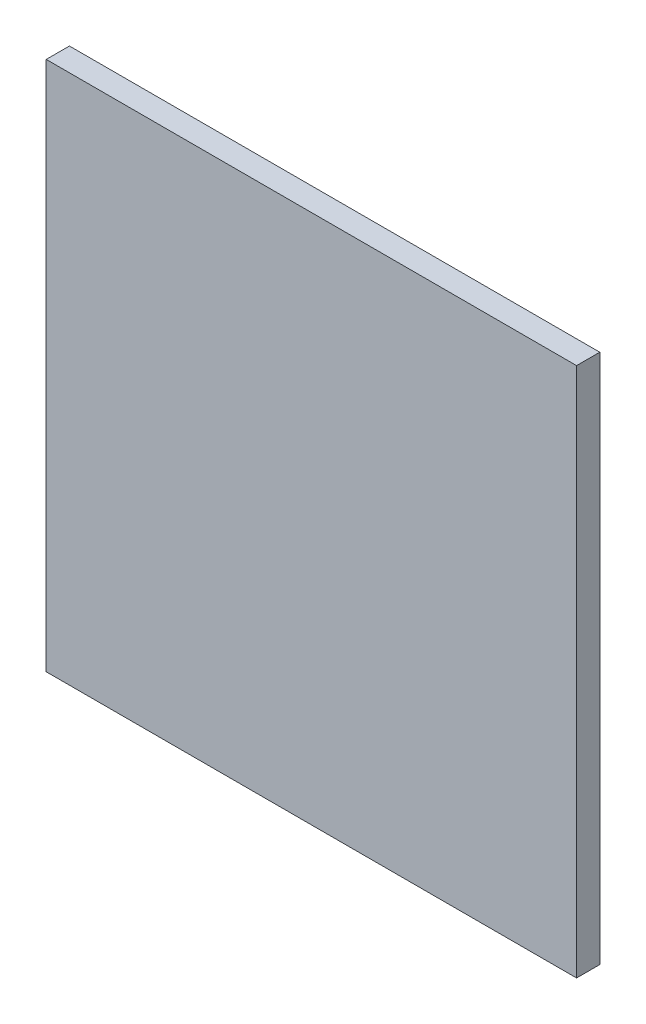
ISO-10303-21;
HEADER;
FILE_DESCRIPTION(('STEP AP214'),'2;1');
FILE_NAME('part.step','',(''),(''),'','','');
FILE_SCHEMA(('AUTOMOTIVE_DESIGN { 1 0 10303 214 1 1 1 1 }'));
ENDSEC;
DATA;
#1=APPLICATION_CONTEXT('core data for automotive mechanical design processes');
#2=APPLICATION_PROTOCOL_DEFINITION('international standard','automotive_design',2000,#1);
#3=PRODUCT_CONTEXT('',#1,'mechanical');
#4=PRODUCT('Part','Part','',(#3));
#5=PRODUCT_RELATED_PRODUCT_CATEGORY('part','',(#4));
#6=PRODUCT_DEFINITION_FORMATION('','',#4);
#7=PRODUCT_DEFINITION_CONTEXT('part definition',#1,'design');
#8=PRODUCT_DEFINITION('design','',#6,#7);
#9=PRODUCT_DEFINITION_SHAPE('','',#8);
#10=(LENGTH_UNIT() NAMED_UNIT(*) SI_UNIT(.MILLI.,.METRE.));
#11=(NAMED_UNIT(*) PLANE_ANGLE_UNIT() SI_UNIT($,.RADIAN.));
#12=(NAMED_UNIT(*) SI_UNIT($,.STERADIAN.) SOLID_ANGLE_UNIT());
#13=UNCERTAINTY_MEASURE_WITH_UNIT(LENGTH_MEASURE(1.E-05),#10,'distance_accuracy_value','');
#14=(GEOMETRIC_REPRESENTATION_CONTEXT(3) GLOBAL_UNCERTAINTY_ASSIGNED_CONTEXT((#13)) GLOBAL_UNIT_ASSIGNED_CONTEXT((#10,
#11,#12)) REPRESENTATION_CONTEXT('',''));
#15=CARTESIAN_POINT('',(0.,0.,0.));
#16=DIRECTION('',(0.,0.,1.));
#17=DIRECTION('',(1.,0.,0.));
#18=AXIS2_PLACEMENT_3D('',#15,#16,#17);
#19=CARTESIAN_POINT('',(-80.,80.,7.));
#20=DIRECTION('',(1.,0.,0.));
#21=DIRECTION('',(0.,1.,0.));
#22=AXIS2_PLACEMENT_3D('',#19,#20,#21);
#23=PLANE('',#22);
#24=DIRECTION('',(0.,-1.,0.));
#25=VECTOR('',#24,1.);
#26=CARTESIAN_POINT('',(-80.,80.,0.));
#27=LINE('',#26,#25);
#28=CARTESIAN_POINT('',(-80.,80.,0.));
#29=VERTEX_POINT('',#28);
#30=CARTESIAN_POINT('',(-80.,-80.,0.));
#31=VERTEX_POINT('',#30);
#32=EDGE_CURVE('E279',#29,#31,#27,.T.);
#33=ORIENTED_EDGE('',*,*,#32,.T.);
#34=DIRECTION('',(0.,0.,-1.));
#35=VECTOR('',#34,1.);
#36=CARTESIAN_POINT('',(-80.,-80.,7.));
#37=LINE('',#36,#35);
#38=CARTESIAN_POINT('',(-80.,-80.,7.));
#39=VERTEX_POINT('',#38);
#40=EDGE_CURVE('E11',#39,#31,#37,.T.);
#41=ORIENTED_EDGE('',*,*,#40,.F.);
#42=DIRECTION('',(0.,-1.,0.));
#43=VECTOR('',#42,1.);
#44=CARTESIAN_POINT('',(-80.,80.,7.));
#45=LINE('',#44,#43);
#46=CARTESIAN_POINT('',(-80.,80.,7.));
#47=VERTEX_POINT('',#46);
#48=EDGE_CURVE('E280',#47,#39,#45,.T.);
#49=ORIENTED_EDGE('',*,*,#48,.F.);
#50=DIRECTION('',(0.,0.,-1.));
#51=VECTOR('',#50,1.);
#52=CARTESIAN_POINT('',(-80.,80.,7.));
#53=LINE('',#52,#51);
#54=EDGE_CURVE('E49',#47,#29,#53,.T.);
#55=ORIENTED_EDGE('',*,*,#54,.T.);
#56=EDGE_LOOP('',(#33,#41,#49,#55));
#57=FACE_BOUND('',#56,.T.);
#58=ADVANCED_FACE('F33',(#57),#23,.F.);
#59=CARTESIAN_POINT('',(-80.,-80.,7.));
#60=DIRECTION('',(0.,1.,0.));
#61=DIRECTION('',(-1.,0.,0.));
#62=AXIS2_PLACEMENT_3D('',#59,#60,#61);
#63=PLANE('',#62);
#64=DIRECTION('',(1.,0.,0.));
#65=VECTOR('',#64,1.);
#66=CARTESIAN_POINT('',(-80.,-80.,0.));
#67=LINE('',#66,#65);
#68=CARTESIAN_POINT('',(80.,-80.,0.));
#69=VERTEX_POINT('',#68);
#70=EDGE_CURVE('E290',#31,#69,#67,.T.);
#71=ORIENTED_EDGE('',*,*,#70,.T.);
#72=DIRECTION('',(0.,0.,-1.));
#73=VECTOR('',#72,1.);
#74=CARTESIAN_POINT('',(80.,-80.,7.));
#75=LINE('',#74,#73);
#76=CARTESIAN_POINT('',(80.,-80.,7.));
#77=VERTEX_POINT('',#76);
#78=EDGE_CURVE('E41',#77,#69,#75,.T.);
#79=ORIENTED_EDGE('',*,*,#78,.F.);
#80=DIRECTION('',(1.,0.,0.));
#81=VECTOR('',#80,1.);
#82=CARTESIAN_POINT('',(-80.,-80.,7.));
#83=LINE('',#82,#81);
#84=EDGE_CURVE('E75',#39,#77,#83,.T.);
#85=ORIENTED_EDGE('',*,*,#84,.F.);
#86=ORIENTED_EDGE('',*,*,#40,.T.);
#87=EDGE_LOOP('',(#71,#79,#85,#86));
#88=FACE_BOUND('',#87,.T.);
#89=ADVANCED_FACE('F302',(#88),#63,.F.);
#90=CARTESIAN_POINT('',(80.,80.,7.));
#91=DIRECTION('',(1.,0.,0.));
#92=DIRECTION('',(0.,1.,0.));
#93=AXIS2_PLACEMENT_3D('',#90,#91,#92);
#94=PLANE('',#93);
#95=DIRECTION('',(0.,-1.,0.));
#96=VECTOR('',#95,1.);
#97=CARTESIAN_POINT('',(80.,80.,0.));
#98=LINE('',#97,#96);
#99=CARTESIAN_POINT('',(80.,80.,0.));
#100=VERTEX_POINT('',#99);
#101=EDGE_CURVE('E293',#100,#69,#98,.T.);
#102=ORIENTED_EDGE('',*,*,#101,.F.);
#103=DIRECTION('',(0.,0.,-1.));
#104=VECTOR('',#103,1.);
#105=CARTESIAN_POINT('',(80.,80.,7.));
#106=LINE('',#105,#104);
#107=CARTESIAN_POINT('',(80.,80.,7.));
#108=VERTEX_POINT('',#107);
#109=EDGE_CURVE('E64',#108,#100,#106,.T.);
#110=ORIENTED_EDGE('',*,*,#109,.F.);
#111=DIRECTION('',(0.,-1.,0.));
#112=VECTOR('',#111,1.);
#113=CARTESIAN_POINT('',(80.,80.,7.));
#114=LINE('',#113,#112);
#115=EDGE_CURVE('E284',#108,#77,#114,.T.);
#116=ORIENTED_EDGE('',*,*,#115,.T.);
#117=ORIENTED_EDGE('',*,*,#78,.T.);
#118=EDGE_LOOP('',(#102,#110,#116,#117));
#119=FACE_BOUND('',#118,.T.);
#120=ADVANCED_FACE('F300',(#119),#94,.T.);
#121=CARTESIAN_POINT('',(-80.,80.,7.));
#122=DIRECTION('',(0.,1.,0.));
#123=DIRECTION('',(-1.,0.,0.));
#124=AXIS2_PLACEMENT_3D('',#121,#122,#123);
#125=PLANE('',#124);
#126=DIRECTION('',(1.,0.,0.));
#127=VECTOR('',#126,1.);
#128=CARTESIAN_POINT('',(-80.,80.,0.));
#129=LINE('',#128,#127);
#130=EDGE_CURVE('E282',#29,#100,#129,.T.);
#131=ORIENTED_EDGE('',*,*,#130,.F.);
#132=ORIENTED_EDGE('',*,*,#54,.F.);
#133=DIRECTION('',(1.,0.,0.));
#134=VECTOR('',#133,1.);
#135=CARTESIAN_POINT('',(-80.,80.,7.));
#136=LINE('',#135,#134);
#137=EDGE_CURVE('E287',#47,#108,#136,.T.);
#138=ORIENTED_EDGE('',*,*,#137,.T.);
#139=ORIENTED_EDGE('',*,*,#109,.T.);
#140=EDGE_LOOP('',(#131,#132,#138,#139));
#141=FACE_BOUND('',#140,.T.);
#142=ADVANCED_FACE('F306',(#141),#125,.T.);
#143=CARTESIAN_POINT('',(0.,0.,7.));
#144=DIRECTION('',(0.,0.,1.));
#145=DIRECTION('',(1.,0.,0.));
#146=AXIS2_PLACEMENT_3D('',#143,#144,#145);
#147=PLANE('',#146);
#148=ORIENTED_EDGE('',*,*,#48,.T.);
#149=ORIENTED_EDGE('',*,*,#84,.T.);
#150=ORIENTED_EDGE('',*,*,#115,.F.);
#151=ORIENTED_EDGE('',*,*,#137,.F.);
#152=EDGE_LOOP('',(#148,#149,#150,#151));
#153=FACE_BOUND('',#152,.T.);
#154=ADVANCED_FACE('F308',(#153),#147,.T.);
#155=CARTESIAN_POINT('',(0.,0.,0.));
#156=DIRECTION('',(0.,0.,1.));
#157=DIRECTION('',(1.,0.,0.));
#158=AXIS2_PLACEMENT_3D('',#155,#156,#157);
#159=PLANE('',#158);
#160=CARTESIAN_POINT('',(0.,0.,0.));
#161=DIRECTION('',(0.,0.,1.));
#162=DIRECTION('',(1.,0.,0.));
#163=AXIS2_PLACEMENT_3D('',#160,#161,#162);
#164=CIRCLE('',#163,76.);
#165=CARTESIAN_POINT('',(76.,0.,0.));
#166=VERTEX_POINT('',#165);
#167=EDGE_CURVE('E221',#166,#166,#164,.T.);
#168=ORIENTED_EDGE('',*,*,#167,.T.);
#169=EDGE_LOOP('',(#168));
#170=FACE_BOUND('',#169,.T.);
#171=ORIENTED_EDGE('',*,*,#32,.F.);
#172=ORIENTED_EDGE('',*,*,#130,.T.);
#173=ORIENTED_EDGE('',*,*,#101,.T.);
#174=ORIENTED_EDGE('',*,*,#70,.F.);
#175=EDGE_LOOP('',(#171,#172,#173,#174));
#176=FACE_BOUND('',#175,.T.);
#177=ADVANCED_FACE('F305',(#170,#176),#159,.F.);
#178=CARTESIAN_POINT('',(0.,27.,3.));
#179=DIRECTION('',(0.,1.,0.));
#180=DIRECTION('',(0.,0.,1.));
#181=AXIS2_PLACEMENT_3D('',#178,#179,#180);
#182=PLANE('',#181);
#183=DIRECTION('',(1.,0.,0.));
#184=VECTOR('',#183,1.);
#185=CARTESIAN_POINT('',(0.,27.,1.));
#186=LINE('',#185,#184);
#187=CARTESIAN_POINT('',(-27.,27.,1.));
#188=VERTEX_POINT('',#187);
#189=CARTESIAN_POINT('',(-11.,27.,1.));
#190=VERTEX_POINT('',#189);
#191=EDGE_CURVE('E228',#188,#190,#186,.T.);
#192=ORIENTED_EDGE('',*,*,#191,.F.);
#193=DIRECTION('',(0.,0.,-1.));
#194=VECTOR('',#193,1.);
#195=CARTESIAN_POINT('',(-27.,27.,3.));
#196=LINE('',#195,#194);
#197=CARTESIAN_POINT('',(-27.,27.,3.));
#198=VERTEX_POINT('',#197);
#199=EDGE_CURVE('E220',#198,#188,#196,.T.);
#200=ORIENTED_EDGE('',*,*,#199,.F.);
#201=DIRECTION('',(1.,0.,0.));
#202=VECTOR('',#201,1.);
#203=CARTESIAN_POINT('',(0.,27.,3.));
#204=LINE('',#203,#202);
#205=CARTESIAN_POINT('',(-11.,27.,3.));
#206=VERTEX_POINT('',#205);
#207=EDGE_CURVE('E204',#198,#206,#204,.T.);
#208=ORIENTED_EDGE('',*,*,#207,.T.);
#209=DIRECTION('',(0.,0.,-1.));
#210=VECTOR('',#209,1.);
#211=CARTESIAN_POINT('',(-11.,27.,3.));
#212=LINE('',#211,#210);
#213=EDGE_CURVE('E218',#206,#190,#212,.T.);
#214=ORIENTED_EDGE('',*,*,#213,.T.);
#215=EDGE_LOOP('',(#192,#200,#208,#214));
#216=FACE_BOUND('',#215,.T.);
#217=ADVANCED_FACE('F217',(#216),#182,.T.);
#218=CARTESIAN_POINT('',(-11.,0.,3.));
#219=DIRECTION('',(-1.,0.,0.));
#220=DIRECTION('',(0.,-1.,0.));
#221=AXIS2_PLACEMENT_3D('',#218,#219,#220);
#222=PLANE('',#221);
#223=DIRECTION('',(0.,1.,0.));
#224=VECTOR('',#223,1.);
#225=CARTESIAN_POINT('',(-11.,0.,1.));
#226=LINE('',#225,#224);
#227=CARTESIAN_POINT('',(-11.,51.,1.));
#228=VERTEX_POINT('',#227);
#229=EDGE_CURVE('E225',#190,#228,#226,.T.);
#230=ORIENTED_EDGE('',*,*,#229,.F.);
#231=ORIENTED_EDGE('',*,*,#213,.F.);
#232=DIRECTION('',(0.,1.,0.));
#233=VECTOR('',#232,1.);
#234=CARTESIAN_POINT('',(-11.,0.,3.));
#235=LINE('',#234,#233);
#236=CARTESIAN_POINT('',(-11.,51.,3.));
#237=VERTEX_POINT('',#236);
#238=EDGE_CURVE('E199',#206,#237,#235,.T.);
#239=ORIENTED_EDGE('',*,*,#238,.T.);
#240=DIRECTION('',(0.,0.,-1.));
#241=VECTOR('',#240,1.);
#242=CARTESIAN_POINT('',(-11.,51.,3.));
#243=LINE('',#242,#241);
#244=EDGE_CURVE('E226',#237,#228,#243,.T.);
#245=ORIENTED_EDGE('',*,*,#244,.T.);
#246=EDGE_LOOP('',(#230,#231,#239,#245));
#247=FACE_BOUND('',#246,.T.);
#248=ADVANCED_FACE('F223',(#247),#222,.T.);
#249=CARTESIAN_POINT('',(0.,51.,3.));
#250=DIRECTION('',(0.,-1.,0.));
#251=DIRECTION('',(1.,0.,0.));
#252=AXIS2_PLACEMENT_3D('',#249,#250,#251);
#253=PLANE('',#252);
#254=ORIENTED_EDGE('',*,*,#244,.F.);
#255=DIRECTION('',(-1.,0.,0.));
#256=VECTOR('',#255,1.);
#257=CARTESIAN_POINT('',(0.,51.,3.));
#258=LINE('',#257,#256);
#259=CARTESIAN_POINT('',(11.,51.,3.));
#260=VERTEX_POINT('',#259);
#261=EDGE_CURVE('E207',#260,#237,#258,.T.);
#262=ORIENTED_EDGE('',*,*,#261,.F.);
#263=DIRECTION('',(0.,0.,-1.));
#264=VECTOR('',#263,1.);
#265=CARTESIAN_POINT('',(11.,51.,3.));
#266=LINE('',#265,#264);
#267=CARTESIAN_POINT('',(11.,51.,1.));
#268=VERTEX_POINT('',#267);
#269=EDGE_CURVE('E230',#260,#268,#266,.T.);
#270=ORIENTED_EDGE('',*,*,#269,.T.);
#271=DIRECTION('',(-1.,0.,0.));
#272=VECTOR('',#271,1.);
#273=CARTESIAN_POINT('',(0.,51.,1.));
#274=LINE('',#273,#272);
#275=EDGE_CURVE('E277',#268,#228,#274,.T.);
#276=ORIENTED_EDGE('',*,*,#275,.T.);
#277=EDGE_LOOP('',(#254,#262,#270,#276));
#278=FACE_BOUND('',#277,.T.);
#279=ADVANCED_FACE('F365',(#278),#253,.F.);
#280=CARTESIAN_POINT('',(11.,0.,3.));
#281=DIRECTION('',(-1.,0.,0.));
#282=DIRECTION('',(0.,-1.,0.));
#283=AXIS2_PLACEMENT_3D('',#280,#281,#282);
#284=PLANE('',#283);
#285=ORIENTED_EDGE('',*,*,#269,.F.);
#286=DIRECTION('',(0.,1.,0.));
#287=VECTOR('',#286,1.);
#288=CARTESIAN_POINT('',(11.,0.,3.));
#289=LINE('',#288,#287);
#290=CARTESIAN_POINT('',(11.,27.,3.));
#291=VERTEX_POINT('',#290);
#292=EDGE_CURVE('E634',#291,#260,#289,.T.);
#293=ORIENTED_EDGE('',*,*,#292,.F.);
#294=DIRECTION('',(0.,0.,-1.));
#295=VECTOR('',#294,1.);
#296=CARTESIAN_POINT('',(11.,27.,3.));
#297=LINE('',#296,#295);
#298=CARTESIAN_POINT('',(11.,27.,1.));
#299=VERTEX_POINT('',#298);
#300=EDGE_CURVE('E630',#291,#299,#297,.T.);
#301=ORIENTED_EDGE('',*,*,#300,.T.);
#302=DIRECTION('',(0.,1.,0.));
#303=VECTOR('',#302,1.);
#304=CARTESIAN_POINT('',(11.,0.,1.));
#305=LINE('',#304,#303);
#306=EDGE_CURVE('E275',#299,#268,#305,.T.);
#307=ORIENTED_EDGE('',*,*,#306,.T.);
#308=EDGE_LOOP('',(#285,#293,#301,#307));
#309=FACE_BOUND('',#308,.T.);
#310=ADVANCED_FACE('F374',(#309),#284,.F.);
#311=CARTESIAN_POINT('',(0.,27.,3.));
#312=DIRECTION('',(0.,-1.,0.));
#313=DIRECTION('',(0.,0.,-1.));
#314=AXIS2_PLACEMENT_3D('',#311,#312,#313);
#315=PLANE('',#314);
#316=ORIENTED_EDGE('',*,*,#300,.F.);
#317=DIRECTION('',(-1.,0.,0.));
#318=VECTOR('',#317,1.);
#319=CARTESIAN_POINT('',(0.,27.,3.));
#320=LINE('',#319,#318);
#321=CARTESIAN_POINT('',(27.,27.,3.));
#322=VERTEX_POINT('',#321);
#323=EDGE_CURVE('E640',#322,#291,#320,.T.);
#324=ORIENTED_EDGE('',*,*,#323,.F.);
#325=DIRECTION('',(0.,0.,-1.));
#326=VECTOR('',#325,1.);
#327=CARTESIAN_POINT('',(27.,27.,3.));
#328=LINE('',#327,#326);
#329=CARTESIAN_POINT('',(27.,27.,1.));
#330=VERTEX_POINT('',#329);
#331=EDGE_CURVE('E627',#322,#330,#328,.T.);
#332=ORIENTED_EDGE('',*,*,#331,.T.);
#333=DIRECTION('',(-1.,0.,0.));
#334=VECTOR('',#333,1.);
#335=CARTESIAN_POINT('',(0.,27.,1.));
#336=LINE('',#335,#334);
#337=EDGE_CURVE('E273',#330,#299,#336,.T.);
#338=ORIENTED_EDGE('',*,*,#337,.T.);
#339=EDGE_LOOP('',(#316,#324,#332,#338));
#340=FACE_BOUND('',#339,.T.);
#341=ADVANCED_FACE('F384',(#340),#315,.F.);
#342=CARTESIAN_POINT('',(27.,0.,3.));
#343=DIRECTION('',(-1.,0.,0.));
#344=DIRECTION('',(0.,-1.,0.));
#345=AXIS2_PLACEMENT_3D('',#342,#343,#344);
#346=PLANE('',#345);
#347=ORIENTED_EDGE('',*,*,#331,.F.);
#348=DIRECTION('',(0.,1.,0.));
#349=VECTOR('',#348,1.);
#350=CARTESIAN_POINT('',(27.,0.,3.));
#351=LINE('',#350,#349);
#352=CARTESIAN_POINT('',(27.,11.,3.));
#353=VERTEX_POINT('',#352);
#354=EDGE_CURVE('E643',#353,#322,#351,.T.);
#355=ORIENTED_EDGE('',*,*,#354,.F.);
#356=DIRECTION('',(0.,0.,-1.));
#357=VECTOR('',#356,1.);
#358=CARTESIAN_POINT('',(27.,11.,3.));
#359=LINE('',#358,#357);
#360=CARTESIAN_POINT('',(27.,11.,1.));
#361=VERTEX_POINT('',#360);
#362=EDGE_CURVE('E624',#353,#361,#359,.T.);
#363=ORIENTED_EDGE('',*,*,#362,.T.);
#364=DIRECTION('',(0.,1.,0.));
#365=VECTOR('',#364,1.);
#366=CARTESIAN_POINT('',(27.,0.,1.));
#367=LINE('',#366,#365);
#368=EDGE_CURVE('E271',#361,#330,#367,.T.);
#369=ORIENTED_EDGE('',*,*,#368,.T.);
#370=EDGE_LOOP('',(#347,#355,#363,#369));
#371=FACE_BOUND('',#370,.T.);
#372=ADVANCED_FACE('F394',(#371),#346,.F.);
#373=CARTESIAN_POINT('',(0.,11.,3.));
#374=DIRECTION('',(0.,-1.,0.));
#375=DIRECTION('',(1.,0.,0.));
#376=AXIS2_PLACEMENT_3D('',#373,#374,#375);
#377=PLANE('',#376);
#378=ORIENTED_EDGE('',*,*,#362,.F.);
#379=DIRECTION('',(-1.,0.,0.));
#380=VECTOR('',#379,1.);
#381=CARTESIAN_POINT('',(0.,11.,3.));
#382=LINE('',#381,#380);
#383=CARTESIAN_POINT('',(51.,11.,3.));
#384=VERTEX_POINT('',#383);
#385=EDGE_CURVE('E646',#384,#353,#382,.T.);
#386=ORIENTED_EDGE('',*,*,#385,.F.);
#387=DIRECTION('',(0.,0.,-1.));
#388=VECTOR('',#387,1.);
#389=CARTESIAN_POINT('',(51.,11.,3.));
#390=LINE('',#389,#388);
#391=CARTESIAN_POINT('',(51.,11.,1.));
#392=VERTEX_POINT('',#391);
#393=EDGE_CURVE('E621',#384,#392,#390,.T.);
#394=ORIENTED_EDGE('',*,*,#393,.T.);
#395=DIRECTION('',(-1.,0.,0.));
#396=VECTOR('',#395,1.);
#397=CARTESIAN_POINT('',(0.,11.,1.));
#398=LINE('',#397,#396);
#399=EDGE_CURVE('E269',#392,#361,#398,.T.);
#400=ORIENTED_EDGE('',*,*,#399,.T.);
#401=EDGE_LOOP('',(#378,#386,#394,#400));
#402=FACE_BOUND('',#401,.T.);
#403=ADVANCED_FACE('F404',(#402),#377,.F.);
#404=CARTESIAN_POINT('',(51.,0.,3.));
#405=DIRECTION('',(1.,0.,0.));
#406=DIRECTION('',(0.,0.,-1.));
#407=AXIS2_PLACEMENT_3D('',#404,#405,#406);
#408=PLANE('',#407);
#409=DIRECTION('',(0.,-1.,0.));
#410=VECTOR('',#409,1.);
#411=CARTESIAN_POINT('',(51.,0.,1.));
#412=LINE('',#411,#410);
#413=CARTESIAN_POINT('',(51.,-11.,1.));
#414=VERTEX_POINT('',#413);
#415=EDGE_CURVE('E266',#392,#414,#412,.T.);
#416=ORIENTED_EDGE('',*,*,#415,.F.);
#417=ORIENTED_EDGE('',*,*,#393,.F.);
#418=DIRECTION('',(0.,-1.,0.));
#419=VECTOR('',#418,1.);
#420=CARTESIAN_POINT('',(51.,0.,3.));
#421=LINE('',#420,#419);
#422=CARTESIAN_POINT('',(51.,-11.,3.));
#423=VERTEX_POINT('',#422);
#424=EDGE_CURVE('E649',#384,#423,#421,.T.);
#425=ORIENTED_EDGE('',*,*,#424,.T.);
#426=DIRECTION('',(0.,0.,-1.));
#427=VECTOR('',#426,1.);
#428=CARTESIAN_POINT('',(51.,-11.,3.));
#429=LINE('',#428,#427);
#430=EDGE_CURVE('E618',#423,#414,#429,.T.);
#431=ORIENTED_EDGE('',*,*,#430,.T.);
#432=EDGE_LOOP('',(#416,#417,#425,#431));
#433=FACE_BOUND('',#432,.T.);
#434=ADVANCED_FACE('F414',(#433),#408,.T.);
#435=CARTESIAN_POINT('',(0.,-11.,3.));
#436=DIRECTION('',(0.,-1.,0.));
#437=DIRECTION('',(1.,0.,0.));
#438=AXIS2_PLACEMENT_3D('',#435,#436,#437);
#439=PLANE('',#438);
#440=DIRECTION('',(-1.,0.,0.));
#441=VECTOR('',#440,1.);
#442=CARTESIAN_POINT('',(0.,-11.,1.));
#443=LINE('',#442,#441);
#444=CARTESIAN_POINT('',(27.,-11.,1.));
#445=VERTEX_POINT('',#444);
#446=EDGE_CURVE('E263',#414,#445,#443,.T.);
#447=ORIENTED_EDGE('',*,*,#446,.F.);
#448=ORIENTED_EDGE('',*,*,#430,.F.);
#449=DIRECTION('',(-1.,0.,0.));
#450=VECTOR('',#449,1.);
#451=CARTESIAN_POINT('',(0.,-11.,3.));
#452=LINE('',#451,#450);
#453=CARTESIAN_POINT('',(27.,-11.,3.));
#454=VERTEX_POINT('',#453);
#455=EDGE_CURVE('E651',#423,#454,#452,.T.);
#456=ORIENTED_EDGE('',*,*,#455,.T.);
#457=DIRECTION('',(0.,0.,-1.));
#458=VECTOR('',#457,1.);
#459=CARTESIAN_POINT('',(27.,-11.,3.));
#460=LINE('',#459,#458);
#461=EDGE_CURVE('E615',#454,#445,#460,.T.);
#462=ORIENTED_EDGE('',*,*,#461,.T.);
#463=EDGE_LOOP('',(#447,#448,#456,#462));
#464=FACE_BOUND('',#463,.T.);
#465=ADVANCED_FACE('F424',(#464),#439,.T.);
#466=CARTESIAN_POINT('',(27.,0.,3.));
#467=DIRECTION('',(1.,0.,0.));
#468=DIRECTION('',(0.,1.,0.));
#469=AXIS2_PLACEMENT_3D('',#466,#467,#468);
#470=PLANE('',#469);
#471=DIRECTION('',(0.,-1.,0.));
#472=VECTOR('',#471,1.);
#473=CARTESIAN_POINT('',(27.,0.,1.));
#474=LINE('',#473,#472);
#475=CARTESIAN_POINT('',(27.,-27.,1.));
#476=VERTEX_POINT('',#475);
#477=EDGE_CURVE('E260',#445,#476,#474,.T.);
#478=ORIENTED_EDGE('',*,*,#477,.F.);
#479=ORIENTED_EDGE('',*,*,#461,.F.);
#480=DIRECTION('',(0.,-1.,0.));
#481=VECTOR('',#480,1.);
#482=CARTESIAN_POINT('',(27.,0.,3.));
#483=LINE('',#482,#481);
#484=CARTESIAN_POINT('',(27.,-27.,3.));
#485=VERTEX_POINT('',#484);
#486=EDGE_CURVE('E655',#454,#485,#483,.T.);
#487=ORIENTED_EDGE('',*,*,#486,.T.);
#488=DIRECTION('',(0.,0.,-1.));
#489=VECTOR('',#488,1.);
#490=CARTESIAN_POINT('',(27.,-27.,3.));
#491=LINE('',#490,#489);
#492=EDGE_CURVE('E612',#485,#476,#491,.T.);
#493=ORIENTED_EDGE('',*,*,#492,.T.);
#494=EDGE_LOOP('',(#478,#479,#487,#493));
#495=FACE_BOUND('',#494,.T.);
#496=ADVANCED_FACE('F434',(#495),#470,.T.);
#497=CARTESIAN_POINT('',(0.,-27.,3.));
#498=DIRECTION('',(0.,-1.,0.));
#499=DIRECTION('',(0.,0.,-1.));
#500=AXIS2_PLACEMENT_3D('',#497,#498,#499);
#501=PLANE('',#500);
#502=DIRECTION('',(-1.,0.,0.));
#503=VECTOR('',#502,1.);
#504=CARTESIAN_POINT('',(0.,-27.,1.));
#505=LINE('',#504,#503);
#506=CARTESIAN_POINT('',(11.,-27.,1.));
#507=VERTEX_POINT('',#506);
#508=EDGE_CURVE('E257',#476,#507,#505,.T.);
#509=ORIENTED_EDGE('',*,*,#508,.F.);
#510=ORIENTED_EDGE('',*,*,#492,.F.);
#511=DIRECTION('',(-1.,0.,0.));
#512=VECTOR('',#511,1.);
#513=CARTESIAN_POINT('',(0.,-27.,3.));
#514=LINE('',#513,#512);
#515=CARTESIAN_POINT('',(11.,-27.,3.));
#516=VERTEX_POINT('',#515);
#517=EDGE_CURVE('E657',#485,#516,#514,.T.);
#518=ORIENTED_EDGE('',*,*,#517,.T.);
#519=DIRECTION('',(0.,0.,-1.));
#520=VECTOR('',#519,1.);
#521=CARTESIAN_POINT('',(11.,-27.,3.));
#522=LINE('',#521,#520);
#523=EDGE_CURVE('E609',#516,#507,#522,.T.);
#524=ORIENTED_EDGE('',*,*,#523,.T.);
#525=EDGE_LOOP('',(#509,#510,#518,#524));
#526=FACE_BOUND('',#525,.T.);
#527=ADVANCED_FACE('F444',(#526),#501,.T.);
#528=CARTESIAN_POINT('',(11.,0.,3.));
#529=DIRECTION('',(1.,0.,0.));
#530=DIRECTION('',(0.,1.,0.));
#531=AXIS2_PLACEMENT_3D('',#528,#529,#530);
#532=PLANE('',#531);
#533=DIRECTION('',(0.,-1.,0.));
#534=VECTOR('',#533,1.);
#535=CARTESIAN_POINT('',(11.,0.,1.));
#536=LINE('',#535,#534);
#537=CARTESIAN_POINT('',(11.,-51.,1.));
#538=VERTEX_POINT('',#537);
#539=EDGE_CURVE('E254',#507,#538,#536,.T.);
#540=ORIENTED_EDGE('',*,*,#539,.F.);
#541=ORIENTED_EDGE('',*,*,#523,.F.);
#542=DIRECTION('',(0.,-1.,0.));
#543=VECTOR('',#542,1.);
#544=CARTESIAN_POINT('',(11.,0.,3.));
#545=LINE('',#544,#543);
#546=CARTESIAN_POINT('',(11.,-51.,3.));
#547=VERTEX_POINT('',#546);
#548=EDGE_CURVE('E663',#516,#547,#545,.T.);
#549=ORIENTED_EDGE('',*,*,#548,.T.);
#550=DIRECTION('',(0.,0.,-1.));
#551=VECTOR('',#550,1.);
#552=CARTESIAN_POINT('',(11.,-51.,3.));
#553=LINE('',#552,#551);
#554=EDGE_CURVE('E606',#547,#538,#553,.T.);
#555=ORIENTED_EDGE('',*,*,#554,.T.);
#556=EDGE_LOOP('',(#540,#541,#549,#555));
#557=FACE_BOUND('',#556,.T.);
#558=ADVANCED_FACE('F454',(#557),#532,.T.);
#559=CARTESIAN_POINT('',(-2.57369882981286E-13,-50.9999999999999,3.));
#560=DIRECTION('',(0.,-1.,0.));
#561=DIRECTION('',(1.,0.,0.));
#562=AXIS2_PLACEMENT_3D('',#559,#560,#561);
#563=PLANE('',#562);
#564=DIRECTION('',(-1.,0.,0.));
#565=VECTOR('',#564,1.);
#566=CARTESIAN_POINT('',(-2.57369882981286E-13,-50.9999999999999,1.));
#567=LINE('',#566,#565);
#568=CARTESIAN_POINT('',(-11.,-50.9999999999999,1.));
#569=VERTEX_POINT('',#568);
#570=EDGE_CURVE('E251',#538,#569,#567,.T.);
#571=ORIENTED_EDGE('',*,*,#570,.F.);
#572=ORIENTED_EDGE('',*,*,#554,.F.);
#573=DIRECTION('',(-1.,0.,0.));
#574=VECTOR('',#573,1.);
#575=CARTESIAN_POINT('',(-2.57369882981286E-13,-50.9999999999999,3.));
#576=LINE('',#575,#574);
#577=CARTESIAN_POINT('',(-11.,-50.9999999999999,3.));
#578=VERTEX_POINT('',#577);
#579=EDGE_CURVE('E665',#547,#578,#576,.T.);
#580=ORIENTED_EDGE('',*,*,#579,.T.);
#581=DIRECTION('',(0.,0.,-1.));
#582=VECTOR('',#581,1.);
#583=CARTESIAN_POINT('',(-11.,-50.9999999999999,3.));
#584=LINE('',#583,#582);
#585=EDGE_CURVE('E603',#578,#569,#584,.T.);
#586=ORIENTED_EDGE('',*,*,#585,.T.);
#587=EDGE_LOOP('',(#571,#572,#580,#586));
#588=FACE_BOUND('',#587,.T.);
#589=ADVANCED_FACE('F464',(#588),#563,.T.);
#590=CARTESIAN_POINT('',(-11.,0.,3.));
#591=DIRECTION('',(1.,0.,0.));
#592=DIRECTION('',(0.,1.,0.));
#593=AXIS2_PLACEMENT_3D('',#590,#591,#592);
#594=PLANE('',#593);
#595=ORIENTED_EDGE('',*,*,#585,.F.);
#596=DIRECTION('',(0.,-1.,0.));
#597=VECTOR('',#596,1.);
#598=CARTESIAN_POINT('',(-11.,0.,3.));
#599=LINE('',#598,#597);
#600=CARTESIAN_POINT('',(-11.,-26.9999999999999,3.));
#601=VERTEX_POINT('',#600);
#602=EDGE_CURVE('E667',#601,#578,#599,.T.);
#603=ORIENTED_EDGE('',*,*,#602,.F.);
#604=DIRECTION('',(0.,0.,-1.));
#605=VECTOR('',#604,1.);
#606=CARTESIAN_POINT('',(-11.,-26.9999999999999,3.));
#607=LINE('',#606,#605);
#608=CARTESIAN_POINT('',(-11.,-26.9999999999999,1.));
#609=VERTEX_POINT('',#608);
#610=EDGE_CURVE('E600',#601,#609,#607,.T.);
#611=ORIENTED_EDGE('',*,*,#610,.T.);
#612=DIRECTION('',(0.,-1.,0.));
#613=VECTOR('',#612,1.);
#614=CARTESIAN_POINT('',(-11.,0.,1.));
#615=LINE('',#614,#613);
#616=EDGE_CURVE('E249',#609,#569,#615,.T.);
#617=ORIENTED_EDGE('',*,*,#616,.T.);
#618=EDGE_LOOP('',(#595,#603,#611,#617));
#619=FACE_BOUND('',#618,.T.);
#620=ADVANCED_FACE('F474',(#619),#594,.F.);
#621=CARTESIAN_POINT('',(0.,-26.9999999999999,3.));
#622=DIRECTION('',(0.,1.,0.));
#623=DIRECTION('',(0.,0.,1.));
#624=AXIS2_PLACEMENT_3D('',#621,#622,#623);
#625=PLANE('',#624);
#626=ORIENTED_EDGE('',*,*,#610,.F.);
#627=DIRECTION('',(1.,0.,0.));
#628=VECTOR('',#627,1.);
#629=CARTESIAN_POINT('',(0.,-26.9999999999999,3.));
#630=LINE('',#629,#628);
#631=CARTESIAN_POINT('',(-27.,-26.9999999999999,3.));
#632=VERTEX_POINT('',#631);
#633=EDGE_CURVE('E670',#632,#601,#630,.T.);
#634=ORIENTED_EDGE('',*,*,#633,.F.);
#635=DIRECTION('',(0.,0.,-1.));
#636=VECTOR('',#635,1.);
#637=CARTESIAN_POINT('',(-27.,-26.9999999999999,3.));
#638=LINE('',#637,#636);
#639=CARTESIAN_POINT('',(-27.,-26.9999999999999,1.));
#640=VERTEX_POINT('',#639);
#641=EDGE_CURVE('E597',#632,#640,#638,.T.);
#642=ORIENTED_EDGE('',*,*,#641,.T.);
#643=DIRECTION('',(1.,0.,0.));
#644=VECTOR('',#643,1.);
#645=CARTESIAN_POINT('',(0.,-26.9999999999999,1.));
#646=LINE('',#645,#644);
#647=EDGE_CURVE('E247',#640,#609,#646,.T.);
#648=ORIENTED_EDGE('',*,*,#647,.T.);
#649=EDGE_LOOP('',(#626,#634,#642,#648));
#650=FACE_BOUND('',#649,.T.);
#651=ADVANCED_FACE('F484',(#650),#625,.F.);
#652=CARTESIAN_POINT('',(-27.,0.,3.));
#653=DIRECTION('',(1.,0.,0.));
#654=DIRECTION('',(0.,1.,0.));
#655=AXIS2_PLACEMENT_3D('',#652,#653,#654);
#656=PLANE('',#655);
#657=ORIENTED_EDGE('',*,*,#641,.F.);
#658=DIRECTION('',(0.,-1.,0.));
#659=VECTOR('',#658,1.);
#660=CARTESIAN_POINT('',(-27.,0.,3.));
#661=LINE('',#660,#659);
#662=CARTESIAN_POINT('',(-27.,-10.9999999999999,3.));
#663=VERTEX_POINT('',#662);
#664=EDGE_CURVE('E673',#663,#632,#661,.T.);
#665=ORIENTED_EDGE('',*,*,#664,.F.);
#666=DIRECTION('',(0.,0.,-1.));
#667=VECTOR('',#666,1.);
#668=CARTESIAN_POINT('',(-27.,-10.9999999999999,3.));
#669=LINE('',#668,#667);
#670=CARTESIAN_POINT('',(-27.,-10.9999999999999,1.));
#671=VERTEX_POINT('',#670);
#672=EDGE_CURVE('E594',#663,#671,#669,.T.);
#673=ORIENTED_EDGE('',*,*,#672,.T.);
#674=DIRECTION('',(0.,-1.,0.));
#675=VECTOR('',#674,1.);
#676=CARTESIAN_POINT('',(-27.,0.,1.));
#677=LINE('',#676,#675);
#678=EDGE_CURVE('E245',#671,#640,#677,.T.);
#679=ORIENTED_EDGE('',*,*,#678,.T.);
#680=EDGE_LOOP('',(#657,#665,#673,#679));
#681=FACE_BOUND('',#680,.T.);
#682=ADVANCED_FACE('F494',(#681),#656,.F.);
#683=CARTESIAN_POINT('',(0.,-10.9999999999999,3.));
#684=DIRECTION('',(0.,1.,0.));
#685=DIRECTION('',(-1.,0.,0.));
#686=AXIS2_PLACEMENT_3D('',#683,#684,#685);
#687=PLANE('',#686);
#688=ORIENTED_EDGE('',*,*,#672,.F.);
#689=DIRECTION('',(1.,0.,0.));
#690=VECTOR('',#689,1.);
#691=CARTESIAN_POINT('',(0.,-10.9999999999999,3.));
#692=LINE('',#691,#690);
#693=CARTESIAN_POINT('',(-51.,-10.9999999999999,3.));
#694=VERTEX_POINT('',#693);
#695=EDGE_CURVE('E676',#694,#663,#692,.T.);
#696=ORIENTED_EDGE('',*,*,#695,.F.);
#697=DIRECTION('',(0.,0.,-1.));
#698=VECTOR('',#697,1.);
#699=CARTESIAN_POINT('',(-51.,-10.9999999999999,3.));
#700=LINE('',#699,#698);
#701=CARTESIAN_POINT('',(-51.,-10.9999999999999,1.));
#702=VERTEX_POINT('',#701);
#703=EDGE_CURVE('E586',#694,#702,#700,.T.);
#704=ORIENTED_EDGE('',*,*,#703,.T.);
#705=DIRECTION('',(1.,0.,0.));
#706=VECTOR('',#705,1.);
#707=CARTESIAN_POINT('',(0.,-10.9999999999999,1.));
#708=LINE('',#707,#706);
#709=EDGE_CURVE('E243',#702,#671,#708,.T.);
#710=ORIENTED_EDGE('',*,*,#709,.T.);
#711=EDGE_LOOP('',(#688,#696,#704,#710));
#712=FACE_BOUND('',#711,.T.);
#713=ADVANCED_FACE('F504',(#712),#687,.F.);
#714=CARTESIAN_POINT('',(-51.,0.,3.));
#715=DIRECTION('',(1.,0.,0.));
#716=DIRECTION('',(0.,0.,-1.));
#717=AXIS2_PLACEMENT_3D('',#714,#715,#716);
#718=PLANE('',#717);
#719=ORIENTED_EDGE('',*,*,#703,.F.);
#720=DIRECTION('',(0.,-1.,0.));
#721=VECTOR('',#720,1.);
#722=CARTESIAN_POINT('',(-51.,0.,3.));
#723=LINE('',#722,#721);
#724=CARTESIAN_POINT('',(-51.,11.,3.));
#725=VERTEX_POINT('',#724);
#726=EDGE_CURVE('E679',#725,#694,#723,.T.);
#727=ORIENTED_EDGE('',*,*,#726,.F.);
#728=DIRECTION('',(0.,0.,-1.));
#729=VECTOR('',#728,1.);
#730=CARTESIAN_POINT('',(-51.,11.,3.));
#731=LINE('',#730,#729);
#732=CARTESIAN_POINT('',(-51.,11.,1.));
#733=VERTEX_POINT('',#732);
#734=EDGE_CURVE('E584',#725,#733,#731,.T.);
#735=ORIENTED_EDGE('',*,*,#734,.T.);
#736=DIRECTION('',(0.,-1.,0.));
#737=VECTOR('',#736,1.);
#738=CARTESIAN_POINT('',(-51.,0.,1.));
#739=LINE('',#738,#737);
#740=EDGE_CURVE('E241',#733,#702,#739,.T.);
#741=ORIENTED_EDGE('',*,*,#740,.T.);
#742=EDGE_LOOP('',(#719,#727,#735,#741));
#743=FACE_BOUND('',#742,.T.);
#744=ADVANCED_FACE('F514',(#743),#718,.F.);
#745=CARTESIAN_POINT('',(0.,11.0000000000001,3.));
#746=DIRECTION('',(0.,1.,0.));
#747=DIRECTION('',(-1.,0.,0.));
#748=AXIS2_PLACEMENT_3D('',#745,#746,#747);
#749=PLANE('',#748);
#750=DIRECTION('',(1.,0.,0.));
#751=VECTOR('',#750,1.);
#752=CARTESIAN_POINT('',(0.,11.0000000000001,1.));
#753=LINE('',#752,#751);
#754=CARTESIAN_POINT('',(-27.,11.0000000000001,1.));
#755=VERTEX_POINT('',#754);
#756=EDGE_CURVE('E238',#733,#755,#753,.T.);
#757=ORIENTED_EDGE('',*,*,#756,.F.);
#758=ORIENTED_EDGE('',*,*,#734,.F.);
#759=DIRECTION('',(1.,0.,0.));
#760=VECTOR('',#759,1.);
#761=CARTESIAN_POINT('',(0.,11.0000000000001,3.));
#762=LINE('',#761,#760);
#763=CARTESIAN_POINT('',(-27.,11.0000000000001,3.));
#764=VERTEX_POINT('',#763);
#765=EDGE_CURVE('E583',#725,#764,#762,.T.);
#766=ORIENTED_EDGE('',*,*,#765,.T.);
#767=DIRECTION('',(0.,0.,-1.));
#768=VECTOR('',#767,1.);
#769=CARTESIAN_POINT('',(-27.,11.0000000000001,3.));
#770=LINE('',#769,#768);
#771=EDGE_CURVE('E580',#764,#755,#770,.T.);
#772=ORIENTED_EDGE('',*,*,#771,.T.);
#773=EDGE_LOOP('',(#757,#758,#766,#772));
#774=FACE_BOUND('',#773,.T.);
#775=ADVANCED_FACE('F524',(#774),#749,.T.);
#776=CARTESIAN_POINT('',(-27.,0.,3.));
#777=DIRECTION('',(-1.,0.,0.));
#778=DIRECTION('',(0.,-1.,0.));
#779=AXIS2_PLACEMENT_3D('',#776,#777,#778);
#780=PLANE('',#779);
#781=DIRECTION('',(0.,1.,0.));
#782=VECTOR('',#781,1.);
#783=CARTESIAN_POINT('',(-27.,0.,1.));
#784=LINE('',#783,#782);
#785=EDGE_CURVE('E235',#755,#188,#784,.T.);
#786=ORIENTED_EDGE('',*,*,#785,.F.);
#787=ORIENTED_EDGE('',*,*,#771,.F.);
#788=DIRECTION('',(0.,1.,0.));
#789=VECTOR('',#788,1.);
#790=CARTESIAN_POINT('',(-27.,0.,3.));
#791=LINE('',#790,#789);
#792=EDGE_CURVE('E683',#764,#198,#791,.T.);
#793=ORIENTED_EDGE('',*,*,#792,.T.);
#794=ORIENTED_EDGE('',*,*,#199,.T.);
#795=EDGE_LOOP('',(#786,#787,#793,#794));
#796=FACE_BOUND('',#795,.T.);
#797=ADVANCED_FACE('F534',(#796),#780,.T.);
#798=CARTESIAN_POINT('',(0.,0.,3.));
#799=DIRECTION('',(0.,0.,-1.));
#800=DIRECTION('',(-1.,0.,0.));
#801=AXIS2_PLACEMENT_3D('',#798,#799,#800);
#802=CYLINDRICAL_SURFACE('',#801,76.);
#803=CARTESIAN_POINT('',(0.,0.,3.));
#804=DIRECTION('',(0.,0.,1.));
#805=DIRECTION('',(1.,0.,0.));
#806=AXIS2_PLACEMENT_3D('',#803,#804,#805);
#807=CIRCLE('',#806,76.);
#808=CARTESIAN_POINT('',(76.,0.,3.));
#809=VERTEX_POINT('',#808);
#810=EDGE_CURVE('E588',#809,#809,#807,.T.);
#811=ORIENTED_EDGE('',*,*,#810,.T.);
#812=EDGE_LOOP('',(#811));
#813=FACE_BOUND('',#812,.T.);
#814=ORIENTED_EDGE('',*,*,#167,.F.);
#815=EDGE_LOOP('',(#814));
#816=FACE_BOUND('',#815,.T.);
#817=ADVANCED_FACE('F544',(#813,#816),#802,.F.);
#818=CARTESIAN_POINT('',(0.,0.,3.));
#819=DIRECTION('',(0.,0.,1.));
#820=DIRECTION('',(1.,0.,0.));
#821=AXIS2_PLACEMENT_3D('',#818,#819,#820);
#822=PLANE('',#821);
#823=ORIENTED_EDGE('',*,*,#207,.F.);
#824=ORIENTED_EDGE('',*,*,#792,.F.);
#825=ORIENTED_EDGE('',*,*,#765,.F.);
#826=ORIENTED_EDGE('',*,*,#726,.T.);
#827=ORIENTED_EDGE('',*,*,#695,.T.);
#828=ORIENTED_EDGE('',*,*,#664,.T.);
#829=ORIENTED_EDGE('',*,*,#633,.T.);
#830=ORIENTED_EDGE('',*,*,#602,.T.);
#831=ORIENTED_EDGE('',*,*,#579,.F.);
#832=ORIENTED_EDGE('',*,*,#548,.F.);
#833=ORIENTED_EDGE('',*,*,#517,.F.);
#834=ORIENTED_EDGE('',*,*,#486,.F.);
#835=ORIENTED_EDGE('',*,*,#455,.F.);
#836=ORIENTED_EDGE('',*,*,#424,.F.);
#837=ORIENTED_EDGE('',*,*,#385,.T.);
#838=ORIENTED_EDGE('',*,*,#354,.T.);
#839=ORIENTED_EDGE('',*,*,#323,.T.);
#840=ORIENTED_EDGE('',*,*,#292,.T.);
#841=ORIENTED_EDGE('',*,*,#261,.T.);
#842=ORIENTED_EDGE('',*,*,#238,.F.);
#843=EDGE_LOOP('',(#823,#824,#825,#826,#827,#828,#829,#830,#831,#832,#833,#834,#835,#836,#837,
#838,#839,#840,#841,#842));
#844=FACE_BOUND('',#843,.T.);
#845=ORIENTED_EDGE('',*,*,#810,.F.);
#846=EDGE_LOOP('',(#845));
#847=FACE_BOUND('',#846,.T.);
#848=ADVANCED_FACE('F201',(#844,#847),#822,.F.);
#849=CARTESIAN_POINT('',(0.,0.,1.));
#850=DIRECTION('',(0.,0.,1.));
#851=DIRECTION('',(1.,0.,0.));
#852=AXIS2_PLACEMENT_3D('',#849,#850,#851);
#853=PLANE('',#852);
#854=ORIENTED_EDGE('',*,*,#229,.T.);
#855=ORIENTED_EDGE('',*,*,#275,.F.);
#856=ORIENTED_EDGE('',*,*,#306,.F.);
#857=ORIENTED_EDGE('',*,*,#337,.F.);
#858=ORIENTED_EDGE('',*,*,#368,.F.);
#859=ORIENTED_EDGE('',*,*,#399,.F.);
#860=ORIENTED_EDGE('',*,*,#415,.T.);
#861=ORIENTED_EDGE('',*,*,#446,.T.);
#862=ORIENTED_EDGE('',*,*,#477,.T.);
#863=ORIENTED_EDGE('',*,*,#508,.T.);
#864=ORIENTED_EDGE('',*,*,#539,.T.);
#865=ORIENTED_EDGE('',*,*,#570,.T.);
#866=ORIENTED_EDGE('',*,*,#616,.F.);
#867=ORIENTED_EDGE('',*,*,#647,.F.);
#868=ORIENTED_EDGE('',*,*,#678,.F.);
#869=ORIENTED_EDGE('',*,*,#709,.F.);
#870=ORIENTED_EDGE('',*,*,#740,.F.);
#871=ORIENTED_EDGE('',*,*,#756,.T.);
#872=ORIENTED_EDGE('',*,*,#785,.T.);
#873=ORIENTED_EDGE('',*,*,#191,.T.);
#874=EDGE_LOOP('',(#854,#855,#856,#857,#858,#859,#860,#861,#862,#863,#864,#865,#866,#867,#868,
#869,#870,#871,#872,#873));
#875=FACE_BOUND('',#874,.T.);
#876=ADVANCED_FACE('F563',(#875),#853,.F.);
#877=CLOSED_SHELL('',(#58,#89,#120,#142,#154,#177,#217,#248,#279,#310,#341,#372,#403,#434,#465,
#496,#527,#558,#589,#620,#651,#682,#713,#744,#775,#797,#817,#848,#876));
#878=MANIFOLD_SOLID_BREP('B2',#877);
#879=ADVANCED_BREP_SHAPE_REPRESENTATION('',(#18,#878),#14);
#880=SHAPE_DEFINITION_REPRESENTATION(#9,#879);
ENDSEC;
END-ISO-10303-21;
